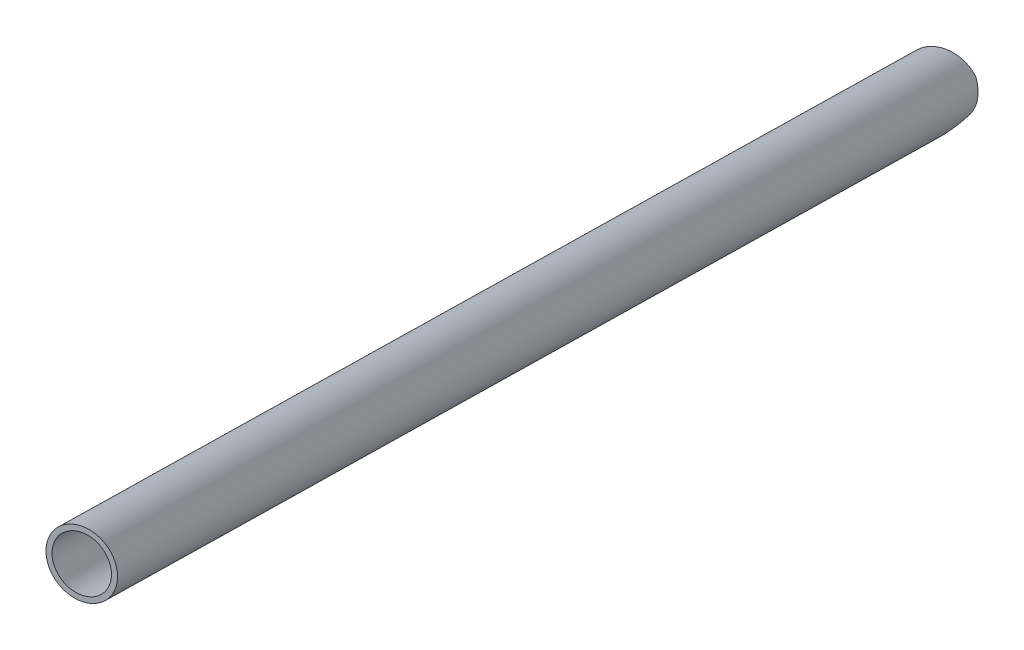
ISO-10303-21;
HEADER;
FILE_DESCRIPTION(('STEP AP214'),'2;1');
FILE_NAME('part.step','',(''),(''),'','','');
FILE_SCHEMA(('AUTOMOTIVE_DESIGN { 1 0 10303 214 1 1 1 1 }'));
ENDSEC;
DATA;
#1=APPLICATION_CONTEXT('core data for automotive mechanical design processes');
#2=APPLICATION_PROTOCOL_DEFINITION('international standard','automotive_design',2000,#1);
#3=PRODUCT_CONTEXT('',#1,'mechanical');
#4=PRODUCT('Part','Part','',(#3));
#5=PRODUCT_RELATED_PRODUCT_CATEGORY('part','',(#4));
#6=PRODUCT_DEFINITION_FORMATION('','',#4);
#7=PRODUCT_DEFINITION_CONTEXT('part definition',#1,'design');
#8=PRODUCT_DEFINITION('design','',#6,#7);
#9=PRODUCT_DEFINITION_SHAPE('','',#8);
#10=(LENGTH_UNIT() NAMED_UNIT(*) SI_UNIT(.MILLI.,.METRE.));
#11=(NAMED_UNIT(*) PLANE_ANGLE_UNIT() SI_UNIT($,.RADIAN.));
#12=(NAMED_UNIT(*) SI_UNIT($,.STERADIAN.) SOLID_ANGLE_UNIT());
#13=UNCERTAINTY_MEASURE_WITH_UNIT(LENGTH_MEASURE(1.E-05),#10,'distance_accuracy_value','');
#14=(GEOMETRIC_REPRESENTATION_CONTEXT(3) GLOBAL_UNCERTAINTY_ASSIGNED_CONTEXT((#13)) GLOBAL_UNIT_ASSIGNED_CONTEXT((#10,
#11,#12)) REPRESENTATION_CONTEXT('',''));
#15=CARTESIAN_POINT('',(0.,0.,0.));
#16=DIRECTION('',(0.,0.,1.));
#17=DIRECTION('',(1.,0.,0.));
#18=AXIS2_PLACEMENT_3D('',#15,#16,#17);
#19=CARTESIAN_POINT('',(-325.,320.,-1580.));
#20=DIRECTION('',(0.345452680982297,0.355322757581791,0.86856674075549));
#21=DIRECTION('',(0.,-0.925546956205677,0.378632845720504));
#22=AXIS2_PLACEMENT_3D('',#19,#20,#21);
#23=CYLINDRICAL_SURFACE('',#22,7.90000000000002);
#24=CARTESIAN_POINT('',(-150.,500.,-1140.));
#25=DIRECTION('',(0.136924020573454,-0.0230393226257373,0.990313587810925));
#26=DIRECTION('',(0.508281006832033,0.859722512143853,-0.0502754433782236));
#27=AXIS2_PLACEMENT_3D('',#24,#25,#26);
#28=ELLIPSE('',#27,8.78492461028727,7.90000000000002);
#29=CARTESIAN_POINT('',(-145.53478967414,507.552597454951,-1140.44166597983));
#30=VERTEX_POINT('',#29);
#31=EDGE_CURVE('E181',#30,#30,#28,.T.);
#32=ORIENTED_EDGE('',*,*,#31,.T.);
#33=EDGE_LOOP('',(#32));
#34=FACE_BOUND('',#33,.T.);
#35=CARTESIAN_POINT('',(-315.062751652289,322.90934877505,-1552.02371895885));
#36=CARTESIAN_POINT('',(-315.134473250997,323.001612742388,-1551.79817735233));
#37=CARTESIAN_POINT('',(-315.213075692378,323.097133272639,-1551.57611262653));
#38=CARTESIAN_POINT('',(-315.387846788828,323.29611463575,-1551.14179447439));
#39=CARTESIAN_POINT('',(-315.48405100144,323.399591291015,-1550.92956201805));
#40=CARTESIAN_POINT('',(-315.645886613939,323.562281394676,-1550.62239005972));
#41=CARTESIAN_POINT('',(-315.70315373489,323.618117867376,-1550.52128580889));
#42=CARTESIAN_POINT('',(-315.824263866916,323.732270928052,-1550.3245889776));
#43=CARTESIAN_POINT('',(-315.888108792042,323.790588235003,-1550.22899801413));
#44=CARTESIAN_POINT('',(-316.090461696434,323.96909405262,-1549.95344332738));
#45=CARTESIAN_POINT('',(-316.240328218652,324.093395383728,-1549.78360576437));
#46=CARTESIAN_POINT('',(-316.502023728975,324.294439176186,-1549.55576883543));
#47=CARTESIAN_POINT('',(-316.601812811816,324.36819926225,-1549.48134662495));
#48=CARTESIAN_POINT('',(-316.812483688144,324.517334800208,-1549.35238127968));
#49=CARTESIAN_POINT('',(-316.923351551352,324.592708132164,-1549.29781357127));
#50=CARTESIAN_POINT('',(-317.155289147075,324.743633066527,-1549.21247733196));
#51=CARTESIAN_POINT('',(-317.276431336805,324.819181517379,-1549.18189667246));
#52=CARTESIAN_POINT('',(-317.524303599189,324.967167525065,-1549.14743062955));
#53=CARTESIAN_POINT('',(-317.651034283709,325.039604739536,-1549.14354817658));
#54=CARTESIAN_POINT('',(-317.894538992831,325.17308951503,-1549.16039969517));
#55=CARTESIAN_POINT('',(-318.011232166373,325.234580856524,-1549.17904572553));
#56=CARTESIAN_POINT('',(-318.242825205686,325.352267883888,-1549.2346652635));
#57=CARTESIAN_POINT('',(-318.357724091305,325.408460754403,-1549.27164845002));
#58=CARTESIAN_POINT('',(-318.661370692479,325.551948639908,-1549.39093757088));
#59=CARTESIAN_POINT('',(-318.847019071835,325.634306569688,-1549.48695048911));
#60=CARTESIAN_POINT('',(-319.206380488894,325.785728158238,-1549.70756514293));
#61=CARTESIAN_POINT('',(-319.380050966344,325.854745838707,-1549.83226261912));
#62=CARTESIAN_POINT('',(-319.713400301447,325.981021474725,-1550.09895135722));
#63=CARTESIAN_POINT('',(-319.873245019865,326.03843488704,-1550.24066681557));
#64=CARTESIAN_POINT('',(-320.183209999078,326.144887056453,-1550.53739282665));
#65=CARTESIAN_POINT('',(-320.333319937005,326.193917010946,-1550.69241710022));
#66=CARTESIAN_POINT('',(-320.625391475377,326.28529293688,-1551.0124974855));
#67=CARTESIAN_POINT('',(-320.767331294544,326.327621524399,-1551.17757819826));
#68=CARTESIAN_POINT('',(-321.043735164567,326.406658859822,-1551.51498120156));
#69=CARTESIAN_POINT('',(-321.178202670158,326.443370218783,-1551.68730007982));
#70=CARTESIAN_POINT('',(-321.529032422825,326.535308199381,-1552.15547944689));
#71=CARTESIAN_POINT('',(-321.739634190833,326.58637686915,-1552.45646649666));
#72=CARTESIAN_POINT('',(-322.146308821395,326.678756946001,-1553.06962687287));
#73=CARTESIAN_POINT('',(-322.3423734399,326.720062845204,-1553.38180639995));
#74=CARTESIAN_POINT('',(-322.722593284639,326.795102213547,-1554.01505231504));
#75=CARTESIAN_POINT('',(-322.90672354202,326.82882014968,-1554.33613544781));
#76=CARTESIAN_POINT('',(-323.264288799425,326.890139438696,-1554.98464931666));
#77=CARTESIAN_POINT('',(-323.437726039135,326.917742075611,-1555.31207870447));
#78=CARTESIAN_POINT('',(-323.775633577969,326.968099613666,-1555.97301265909));
#79=CARTESIAN_POINT('',(-323.940078132898,326.990841088967,-1556.30653135865));
#80=CARTESIAN_POINT('',(-324.260392848003,327.032341725529,-1556.97791233439));
#81=CARTESIAN_POINT('',(-324.416262587859,327.051100691703,-1557.31577482249));
#82=CARTESIAN_POINT('',(-324.719892381055,327.085420560105,-1557.99482511167));
#83=CARTESIAN_POINT('',(-324.867661277613,327.100985002698,-1558.33600878777));
#84=CARTESIAN_POINT('',(-325.1557007127,327.129649335968,-1559.02160984813));
#85=CARTESIAN_POINT('',(-325.295971446685,327.142749290909,-1559.36602714783));
#86=CARTESIAN_POINT('',(-325.644676874812,327.173869853174,-1560.24856667928));
#87=CARTESIAN_POINT('',(-325.848033633516,327.19061908193,-1560.78874747158));
#88=CARTESIAN_POINT('',(-326.237593481705,327.222186546649,-1561.87545308429));
#89=CARTESIAN_POINT('',(-326.42379216756,327.237004287297,-1562.42197949302));
#90=CARTESIAN_POINT('',(-326.778032220008,327.267328313365,-1563.52061697192));
#91=CARTESIAN_POINT('',(-326.946082223163,327.282834266279,-1564.07272524779));
#92=CARTESIAN_POINT('',(-327.182830831613,327.30905742343,-1564.90507736246));
#93=CARTESIAN_POINT('',(-327.259186028803,327.31829148328,-1565.18319940305));
#94=CARTESIAN_POINT('',(-327.406285196693,327.338262830295,-1565.74086261521));
#95=CARTESIAN_POINT('',(-327.477029286697,327.349000085484,-1566.02040375649));
#96=CARTESIAN_POINT('',(-327.647181946017,327.378624772397,-1566.72551769372));
#97=CARTESIAN_POINT('',(-327.742551553386,327.398859246578,-1567.15203325064));
#98=CARTESIAN_POINT('',(-327.872339195339,327.434716828824,-1567.79429990684));
#99=CARTESIAN_POINT('',(-327.913401191853,327.44759180489,-1568.00887066674));
#100=CARTESIAN_POINT('',(-327.990467673213,327.475582105221,-1568.43876813966));
#101=CARTESIAN_POINT('',(-328.026472486376,327.490697283918,-1568.65409480268));
#102=CARTESIAN_POINT('',(-328.092599164349,327.523579690399,-1569.08494526001));
#103=CARTESIAN_POINT('',(-328.122734402132,327.541340722964,-1569.30046745504));
#104=CARTESIAN_POINT('',(-328.17626897708,327.580048498769,-1569.73204884213));
#105=CARTESIAN_POINT('',(-328.199669134683,327.600994853512,-1569.94810796554));
#106=CARTESIAN_POINT('',(-328.238521349509,327.646620011967,-1570.38036997568));
#107=CARTESIAN_POINT('',(-328.253980425301,327.671295494708,-1570.59657256577));
#108=CARTESIAN_POINT('',(-328.275480687108,327.724988256206,-1571.02888168633));
#109=CARTESIAN_POINT('',(-328.281524322493,327.754004403612,-1571.24498822715));
#110=CARTESIAN_POINT('',(-328.282311821199,327.813811671524,-1571.65487674946));
#111=CARTESIAN_POINT('',(-328.278128737796,327.844132491409,-1571.84872282016));
#112=CARTESIAN_POINT('',(-328.259058460194,327.909127398989,-1572.23518798285));
#113=CARTESIAN_POINT('',(-328.244171446623,327.943801413216,-1572.42780709548));
#114=CARTESIAN_POINT('',(-328.201946667763,328.017643385487,-1572.8105460658));
#115=CARTESIAN_POINT('',(-328.17462772075,328.056804484615,-1573.00066925567));
#116=CARTESIAN_POINT('',(-328.105708350145,328.139560010679,-1573.37737571437));
#117=CARTESIAN_POINT('',(-328.064108265339,328.183154332431,-1573.56395906707));
#118=CARTESIAN_POINT('',(-327.964165771501,328.27494455084,-1573.93482729551));
#119=CARTESIAN_POINT('',(-327.905569410897,328.323202229346,-1574.11902937865));
#120=CARTESIAN_POINT('',(-327.770662092226,328.422530565605,-1574.48007188139));
#121=CARTESIAN_POINT('',(-327.694352471511,328.473601010773,-1574.65691285557));
#122=CARTESIAN_POINT('',(-327.523648486949,328.576716044246,-1575.00123855902));
#123=CARTESIAN_POINT('',(-327.429263630416,328.628760107513,-1575.16872814744));
#124=CARTESIAN_POINT('',(-327.222948657387,328.731580802285,-1575.49293707344));
#125=CARTESIAN_POINT('',(-327.111019657599,328.782357514219,-1575.6496570956));
#126=CARTESIAN_POINT('',(-326.889260131161,328.872801598574,-1575.92857864103));
#127=CARTESIAN_POINT('',(-326.781679768766,328.912986722373,-1576.05241302255));
#128=CARTESIAN_POINT('',(-326.556140998548,328.989293163665,-1576.29155411128));
#129=CARTESIAN_POINT('',(-326.438183761886,329.025414938712,-1576.40686177814));
#130=CARTESIAN_POINT('',(-326.193114324733,329.092375287829,-1576.62917332161));
#131=CARTESIAN_POINT('',(-326.065994208984,329.123209214445,-1576.73616984888));
#132=CARTESIAN_POINT('',(-325.804047188891,329.178500067238,-1576.94206526338));
#133=CARTESIAN_POINT('',(-325.669219716932,329.202956523001,-1577.04096355289));
#134=CARTESIAN_POINT('',(-325.385154294276,329.245841250686,-1577.23658910132));
#135=CARTESIAN_POINT('',(-325.235534258519,329.263836456699,-1577.33285596077));
#136=CARTESIAN_POINT('',(-324.930611782362,329.290923108954,-1577.51728001731));
#137=CARTESIAN_POINT('',(-324.775309267141,329.300014437916,-1577.60543710757));
#138=CARTESIAN_POINT('',(-324.460358283769,329.308694736826,-1577.77413395971));
#139=CARTESIAN_POINT('',(-324.300709587436,329.308283206893,-1577.85467332065));
#140=CARTESIAN_POINT('',(-323.97830395136,329.297524070552,-1578.00856159572));
#141=CARTESIAN_POINT('',(-323.815546703933,329.287175475522,-1578.08190979361));
#142=CARTESIAN_POINT('',(-323.46188631531,329.253769400512,-1578.23295205986));
#143=CARTESIAN_POINT('',(-323.270643222757,329.228944678204,-1578.30946630659));
#144=CARTESIAN_POINT('',(-322.887179158994,329.165264307871,-1578.45372186309));
#145=CARTESIAN_POINT('',(-322.69495810132,329.126407397209,-1578.52146238263));
#146=CARTESIAN_POINT('',(-322.311004737556,329.034575470254,-1578.64848897496));
#147=CARTESIAN_POINT('',(-322.119272659723,328.981594769119,-1578.70777162866));
#148=CARTESIAN_POINT('',(-321.737816639892,328.861622251745,-1578.81803017465));
#149=CARTESIAN_POINT('',(-321.548092721317,328.794630272274,-1578.86900597016));
#150=CARTESIAN_POINT('',(-321.160633636333,328.642420526771,-1578.96556245809));
#151=CARTESIAN_POINT('',(-320.963106613906,328.556346402177,-1579.01063141133));
#152=CARTESIAN_POINT('',(-320.573323490459,328.369200084173,-1579.09150107925));
#153=CARTESIAN_POINT('',(-320.381067632062,328.268127201763,-1579.12730136794));
#154=CARTESIAN_POINT('',(-320.003222414726,328.051635993711,-1579.18951056107));
#155=CARTESIAN_POINT('',(-319.817633200204,327.936217357546,-1579.21591926218));
#156=CARTESIAN_POINT('',(-319.454410133791,327.691858850717,-1579.25912330664));
#157=CARTESIAN_POINT('',(-319.276776231222,327.562919066205,-1579.27591871125));
#158=CARTESIAN_POINT('',(-318.929141104477,327.291344151521,-1579.29967872581));
#159=CARTESIAN_POINT('',(-318.759218178317,327.148601294755,-1579.3065580043));
#160=CARTESIAN_POINT('',(-318.429699345596,326.851540015881,-1579.30977831932));
#161=CARTESIAN_POINT('',(-318.27010359801,326.697221415658,-1579.30611919366));
#162=CARTESIAN_POINT('',(-317.962095480456,326.378305748071,-1579.28770237598));
#163=CARTESIAN_POINT('',(-317.813687306873,326.21370486581,-1579.27294054196));
#164=CARTESIAN_POINT('',(-317.528875963735,325.875825582994,-1579.2316175292));
#165=CARTESIAN_POINT('',(-317.392472597366,325.702547324775,-1579.20505654394));
#166=CARTESIAN_POINT('',(-317.132765768942,325.349780363354,-1579.1394115678));
#167=CARTESIAN_POINT('',(-317.009412245917,325.170319175619,-1579.10037792829));
#168=CARTESIAN_POINT('',(-316.775555381649,324.806521069631,-1579.0087350014));
#169=CARTESIAN_POINT('',(-316.665052924449,324.622183817016,-1578.95612478086));
#170=CARTESIAN_POINT('',(-316.457143866293,324.251104154342,-1578.83618652381));
#171=CARTESIAN_POINT('',(-316.359727784822,324.064363594029,-1578.76886923581));
#172=CARTESIAN_POINT('',(-316.177815007134,323.691078403504,-1578.61818263235));
#173=CARTESIAN_POINT('',(-316.093314917161,323.504533734658,-1578.53481754661));
#174=CARTESIAN_POINT('',(-315.953624406063,323.174537717612,-1578.37050559913));
#175=CARTESIAN_POINT('',(-315.896037001182,323.030436810528,-1578.29288559277));
#176=CARTESIAN_POINT('',(-315.788203214879,322.746050158138,-1578.1263949592));
#177=CARTESIAN_POINT('',(-315.737955272766,322.605763606911,-1578.03752673138));
#178=CARTESIAN_POINT('',(-315.64435481722,322.331052867997,-1577.84831147566));
#179=CARTESIAN_POINT('',(-315.600992174019,322.196620283366,-1577.74798169124));
#180=CARTESIAN_POINT('',(-315.520410909517,321.935286122479,-1577.5356946956));
#181=CARTESIAN_POINT('',(-315.483192274949,321.808384529961,-1577.42373750947));
#182=CARTESIAN_POINT('',(-315.413983544143,321.563453222816,-1577.1881757229));
#183=CARTESIAN_POINT('',(-315.382011844821,321.445455476406,-1577.06453243908));
#184=CARTESIAN_POINT('',(-315.322556411224,321.220257758669,-1576.8067922186));
#185=CARTESIAN_POINT('',(-315.295072514544,321.113057396662,-1576.67269566048));
#186=CARTESIAN_POINT('',(-315.243667632452,320.910342145585,-1576.39528542463));
#187=CARTESIAN_POINT('',(-315.219747248778,320.814829230557,-1576.25197019606));
#188=CARTESIAN_POINT('',(-315.174611006077,320.635784007447,-1575.95761960739));
#189=CARTESIAN_POINT('',(-315.153395957047,320.552255286592,-1575.80658195401));
#190=CARTESIAN_POINT('',(-315.10590726777,320.370016818226,-1575.44490124368));
#191=CARTESIAN_POINT('',(-315.080429428612,320.276082029009,-1575.23174573541));
#192=CARTESIAN_POINT('',(-315.031638422401,320.107714601253,-1574.79764751774));
#193=CARTESIAN_POINT('',(-315.008326293903,320.033291288489,-1574.57670114161));
#194=CARTESIAN_POINT('',(-314.962903767615,319.901263406701,-1574.12894656505));
#195=CARTESIAN_POINT('',(-314.940797839137,319.843718331379,-1573.90212062546));
#196=CARTESIAN_POINT('',(-314.897361373613,319.743248018162,-1573.44529266768));
#197=CARTESIAN_POINT('',(-314.876030695554,319.700320109504,-1573.21529123771));
#198=CARTESIAN_POINT('',(-314.824044330951,319.609560295052,-1572.64568561207));
#199=CARTESIAN_POINT('',(-314.793674541773,319.568762740206,-1572.30494543927));
#200=CARTESIAN_POINT('',(-314.733767514241,319.507488823733,-1571.62150232634));
#201=CARTESIAN_POINT('',(-314.704230794737,319.487024866034,-1571.27879831625));
#202=CARTESIAN_POINT('',(-314.646092253586,319.462024137762,-1570.59202840306));
#203=CARTESIAN_POINT('',(-314.617492597903,319.457521997677,-1570.24796115818));
#204=CARTESIAN_POINT('',(-314.561593805092,319.461319680913,-1569.55990387682));
#205=CARTESIAN_POINT('',(-314.534294384078,319.469616696411,-1569.21591383996));
#206=CARTESIAN_POINT('',(-314.481162315284,319.496768894256,-1568.52594608454));
#207=CARTESIAN_POINT('',(-314.455340654451,319.515694067962,-1568.17997039635));
#208=CARTESIAN_POINT('',(-314.405736731456,319.562427529641,-1567.48847039269));
#209=CARTESIAN_POINT('',(-314.38195455591,319.590236194654,-1567.142946097));
#210=CARTESIAN_POINT('',(-314.336843165949,319.653435740117,-1566.45290803349));
#211=CARTESIAN_POINT('',(-314.31551069727,319.68881637842,-1566.10839353164));
#212=CARTESIAN_POINT('',(-314.275649365077,319.766269877681,-1565.41995318487));
#213=CARTESIAN_POINT('',(-314.257120559204,319.808342876193,-1565.0760273522));
#214=CARTESIAN_POINT('',(-314.218713248521,319.910642167128,-1564.29636742617));
#215=CARTESIAN_POINT('',(-314.199812603609,319.972707165037,-1563.8608255233));
#216=CARTESIAN_POINT('',(-314.168046512931,320.105621558556,-1562.99085276412));
#217=CARTESIAN_POINT('',(-314.15518125218,320.176471223373,-1562.55642194226));
#218=CARTESIAN_POINT('',(-314.136460511769,320.326505421008,-1561.68839268697));
#219=CARTESIAN_POINT('',(-314.130612147163,320.40569832544,-1561.25479554277));
#220=CARTESIAN_POINT('',(-314.127103084642,320.572142322438,-1560.38912567151));
#221=CARTESIAN_POINT('',(-314.129442090346,320.659393123197,-1559.95705288985));
#222=CARTESIAN_POINT('',(-314.143669988183,320.841448162128,-1559.0975264601));
#223=CARTESIAN_POINT('',(-314.155497883899,320.936200682364,-1558.67006092668));
#224=CARTESIAN_POINT('',(-314.190380704967,321.134116362551,-1557.81745837149));
#225=CARTESIAN_POINT('',(-314.213437074569,321.23728060303,-1557.39232165637));
#226=CARTESIAN_POINT('',(-314.273057300455,321.452568161879,-1556.54586640127));
#227=CARTESIAN_POINT('',(-314.30960280675,321.564679147875,-1556.12454346723));
#228=CARTESIAN_POINT('',(-314.399356479976,321.799089982005,-1555.28658527251));
#229=CARTESIAN_POINT('',(-314.45255871084,321.921386188986,-1554.86994839652));
#230=CARTESIAN_POINT('',(-314.54859572444,322.114279137691,-1554.24882622035));
#231=CARTESIAN_POINT('',(-314.583463706925,322.180398404553,-1554.04171013276));
#232=CARTESIAN_POINT('',(-314.65946223693,322.316023024786,-1553.62970484601));
#233=CARTESIAN_POINT('',(-314.700593470795,322.385528748686,-1553.42481589354));
#234=CARTESIAN_POINT('',(-314.79008615696,322.528227869215,-1553.0181853567));
#235=CARTESIAN_POINT('',(-314.838439005685,322.601416809912,-1552.81644033839));
#236=CARTESIAN_POINT('',(-314.943727396589,322.752040490303,-1552.41683516243));
#237=CARTESIAN_POINT('',(-315.000661045961,322.829474291247,-1552.21897415886));
#238=CARTESIAN_POINT('',(-315.062751652289,322.90934877505,-1552.02371895885));
#239=B_SPLINE_CURVE_WITH_KNOTS('',3,(#35,#36,#37,#38,#39,#40,#41,#42,#43,#44,#45,#46,#47,#48,
#49,#50,#51,#52,#53,#54,#55,#56,#57,#58,#59,#60,#61,#62,#63,#64,#65,#66,#67,#68,#69,#70,#71,#72,
#73,#74,#75,#76,#77,#78,#79,#80,#81,#82,#83,#84,#85,#86,#87,#88,#89,#90,#91,#92,#93,#94,#95,#96,
#97,#98,#99,#100,#101,#102,#103,#104,#105,#106,#107,#108,#109,#110,#111,#112,#113,#114,#115,
#116,#117,#118,#119,#120,#121,#122,#123,#124,#125,#126,#127,#128,#129,#130,#131,#132,#133,#134,
#135,#136,#137,#138,#139,#140,#141,#142,#143,#144,#145,#146,#147,#148,#149,#150,#151,#152,#153,
#154,#155,#156,#157,#158,#159,#160,#161,#162,#163,#164,#165,#166,#167,#168,#169,#170,#171,#172,
#173,#174,#175,#176,#177,#178,#179,#180,#181,#182,#183,#184,#185,#186,#187,#188,#189,#190,#191,
#192,#193,#194,#195,#196,#197,#198,#199,#200,#201,#202,#203,#204,#205,#206,#207,#208,#209,#210,
#211,#212,#213,#214,#215,#216,#217,#218,#219,#220,#221,#222,#223,#224,#225,#226,#227,#228,#229,
#230,#231,#232,#233,#234,#235,#236,#237,#238),.UNSPECIFIED.,.T.,.F.,(4,2,2,2,2,2,2,2,2,2,2,2,2,
2,2,2,2,2,2,2,2,2,2,2,2,2,2,2,2,2,2,2,2,2,2,2,2,2,2,2,2,2,2,2,2,2,2,2,2,2,2,2,2,2,2,2,2,2,2,2,2,
2,2,2,2,2,2,2,2,2,2,2,2,2,2,2,2,2,2,2,2,2,2,2,2,2,2,2,2,2,2,2,2,2,2,2,2,2,2,2,2,4),(0.,
0.761938753431059,1.52543405243347,1.91188162196488,2.29844196176946,3.06757351031861,
3.50024357268385,3.93237628925763,4.36786066960813,4.8033928486521,5.20147574702147,
5.59976898960258,6.26980396084841,6.94210862172127,7.60470262427211,8.2679881321772,
8.93296702179642,9.59763586388088,10.7094349856174,11.8218598635848,12.9365416354506,
14.0509891350211,15.1684759102346,16.2860174139014,17.4023136219887,18.5185807170563,
20.2505555133723,21.9829735912936,23.7145635822883,24.5801921024936,25.4458022127219,
26.7579459844109,27.4144214634161,28.0708543037152,28.7257735987529,29.3806130805685,
30.0348727952908,30.6889622798605,31.2774150974327,31.8658579851956,32.4534130918945,
33.0409542611618,33.6377712650992,34.2345432239665,34.8310021472479,35.427423120527,
35.9335039290597,36.4395276930506,36.9459939436051,37.4524975414583,37.9884445844088,
38.5243986866208,39.0603809818302,39.5964166065085,40.2181463417642,40.8399320352162,
41.4619683770559,42.0840119660201,42.7436219858231,43.4032623156579,44.0629169263007,
44.7225673340743,45.3878610372984,46.0531649794062,46.7187172435034,47.3842585940431,
48.0471464344518,48.7100798489511,49.3725303765248,50.034806540876,50.5548276719838,
51.0747380624082,51.5938763193258,52.1130134551974,52.6339336127314,53.1548349151835,
53.6758240782231,54.1969688649217,54.8987700814342,55.6009061243281,56.3054881593452,
57.0099413880551,58.0426208669765,59.075929916374,60.1114794482396,61.1468018378827,
62.1890236351734,63.2312896729394,64.2721547120528,65.3130411476432,66.6339460800074,
67.9548915016306,69.2771752178874,70.5994110681139,71.9132147895018,73.2271875421352,
74.5393793763065,75.8511041072377,76.5115810919957,77.1721305059272,77.8318991512641,
78.4915224730745),.UNSPECIFIED.);
#240=CARTESIAN_POINT('',(-314.254237401406,319.817607713583,-1565.01054982519));
#241=VERTEX_POINT('',#240);
#242=CARTESIAN_POINT('',(-324.682386689549,329.302305976699,-1577.65492780784));
#243=VERTEX_POINT('',#242);
#244=EDGE_CURVE('E133',#241,#243,#239,.T.);
#245=ORIENTED_EDGE('',*,*,#244,.T.);
#246=CARTESIAN_POINT('',(-317.472241548848,320.431016310017,-1558.08186498448));
#247=CARTESIAN_POINT('',(-317.63813074169,320.464266602746,-1558.00060624777));
#248=CARTESIAN_POINT('',(-317.810937112455,320.498781745218,-1557.93373181016));
#249=CARTESIAN_POINT('',(-318.165397213559,320.569326791691,-1557.83172279909));
#250=CARTESIAN_POINT('',(-318.347053919309,320.605357204549,-1557.79659897863));
#251=CARTESIAN_POINT('',(-318.712614336579,320.677656094674,-1557.75763482161));
#252=CARTESIAN_POINT('',(-318.896503563385,320.713922670102,-1557.75364892601));
#253=CARTESIAN_POINT('',(-319.262780506473,320.786023608516,-1557.77327457647));
#254=CARTESIAN_POINT('',(-319.44516706243,320.821857645921,-1557.79690574307));
#255=CARTESIAN_POINT('',(-319.915316281558,320.914157695831,-1557.88886912182));
#256=CARTESIAN_POINT('',(-320.199615927935,320.969899726623,-1557.97565901436));
#257=CARTESIAN_POINT('',(-320.613383873994,321.051165638443,-1558.13796858501));
#258=CARTESIAN_POINT('',(-320.749435010719,321.077910811392,-1558.19756737989));
#259=CARTESIAN_POINT('',(-321.017329088519,321.130659372517,-1558.3258895191));
#260=CARTESIAN_POINT('',(-321.149172800415,321.156662896474,-1558.39461118004));
#261=CARTESIAN_POINT('',(-321.518956778656,321.229770567945,-1558.60140076128));
#262=CARTESIAN_POINT('',(-321.751852118166,321.276028588166,-1558.74877370215));
#263=CARTESIAN_POINT('',(-322.204485196678,321.366564711261,-1559.06310860946));
#264=CARTESIAN_POINT('',(-322.424210765859,321.410840973566,-1559.23008828493));
#265=CARTESIAN_POINT('',(-322.852198047963,321.497930369903,-1559.579477102));
#266=CARTESIAN_POINT('',(-323.060429388053,321.540739523799,-1559.76192416824));
#267=CARTESIAN_POINT('',(-323.465972935673,321.625181976612,-1560.13861665749));
#268=CARTESIAN_POINT('',(-323.663288578262,321.6668156434,-1560.33285832803));
#269=CARTESIAN_POINT('',(-324.069788840155,321.753963165687,-1560.7533218496));
#270=CARTESIAN_POINT('',(-324.277810455529,321.799386449685,-1560.98068274367));
#271=CARTESIAN_POINT('',(-324.682953539391,321.889821180637,-1561.4450440874));
#272=CARTESIAN_POINT('',(-324.880072401126,321.934832526973,-1561.68204681904));
#273=CARTESIAN_POINT('',(-325.264487968673,322.025003596949,-1562.1642719543));
#274=CARTESIAN_POINT('',(-325.451773655136,322.070163429228,-1562.40950309511));
#275=CARTESIAN_POINT('',(-325.816968311288,322.161124103961,-1562.9066857261));
#276=CARTESIAN_POINT('',(-325.99487806512,322.206924892403,-1563.1586366516));
#277=CARTESIAN_POINT('',(-326.341870747347,322.299780111547,-1563.66839839841));
#278=CARTESIAN_POINT('',(-326.510951593767,322.346834834026,-1563.92621058149));
#279=CARTESIAN_POINT('',(-326.840548998569,322.442874511213,-1564.44691137729));
#280=CARTESIAN_POINT('',(-327.001065189705,322.491859548534,-1564.70980020705));
#281=CARTESIAN_POINT('',(-327.31350801084,322.592533643663,-1565.23984561705));
#282=CARTESIAN_POINT('',(-327.465441144419,322.644220595399,-1565.50699876377));
#283=CARTESIAN_POINT('',(-327.76071796201,322.751325524282,-1566.04524929581));
#284=CARTESIAN_POINT('',(-327.904062394054,322.806743175608,-1566.31634633507));
#285=CARTESIAN_POINT('',(-328.178809685239,322.921333616941,-1566.85622878493));
#286=CARTESIAN_POINT('',(-328.310402250561,322.98040087604,-1567.12493982817));
#287=CARTESIAN_POINT('',(-328.564285787081,323.104836572062,-1567.66533727979));
#288=CARTESIAN_POINT('',(-328.686575900395,323.170205588886,-1567.93702395995));
#289=CARTESIAN_POINT('',(-328.92057656324,323.309173666333,-1568.48272175015));
#290=CARTESIAN_POINT('',(-329.032291711297,323.382769119043,-1568.75673179288));
#291=CARTESIAN_POINT('',(-329.243259783625,323.54075411108,-1569.30644528916));
#292=CARTESIAN_POINT('',(-329.342515887506,323.625140885265,-1569.58214829175));
#293=CARTESIAN_POINT('',(-329.499219077553,323.78172110466,-1570.0547796893));
#294=CARTESIAN_POINT('',(-329.560484891379,323.850451641454,-1570.25158170226));
#295=CARTESIAN_POINT('',(-329.673543176923,323.996493910318,-1570.64480876506));
#296=CARTESIAN_POINT('',(-329.72533455238,324.073806633748,-1570.84123376868));
#297=CARTESIAN_POINT('',(-329.817236022837,324.238311280946,-1571.23221131788));
#298=CARTESIAN_POINT('',(-329.857371360149,324.325481279899,-1571.42676701398));
#299=CARTESIAN_POINT('',(-329.923448651745,324.511180331269,-1571.8128598716));
#300=CARTESIAN_POINT('',(-329.949397676572,324.6097036954,-1572.00439849053));
#301=CARTESIAN_POINT('',(-329.979081095655,324.788886027559,-1572.32816013689));
#302=CARTESIAN_POINT('',(-329.987051691912,324.866567368588,-1572.46164371185));
#303=CARTESIAN_POINT('',(-329.993087127691,325.028035431531,-1572.72507803195));
#304=CARTESIAN_POINT('',(-329.991155202541,325.111820150546,-1572.85502991701));
#305=CARTESIAN_POINT('',(-329.976395608444,325.284962911836,-1573.11030630013));
#306=CARTESIAN_POINT('',(-329.963582004482,325.374313621772,-1573.23563655373));
#307=CARTESIAN_POINT('',(-329.926349138807,325.557811197983,-1573.48096381055));
#308=CARTESIAN_POINT('',(-329.90192986393,325.651958069699,-1573.60096080772));
#309=CARTESIAN_POINT('',(-329.841082879518,325.843979379464,-1573.83518932698));
#310=CARTESIAN_POINT('',(-329.804631048877,325.941860952841,-1573.94940873221));
#311=CARTESIAN_POINT('',(-329.719811663811,326.139653995344,-1574.1714748752));
#312=CARTESIAN_POINT('',(-329.671443899045,326.239565500275,-1574.27932150043));
#313=CARTESIAN_POINT('',(-329.563139137754,326.440005424084,-1574.48882820975));
#314=CARTESIAN_POINT('',(-329.503181612938,326.540534626529,-1574.59047688918));
#315=CARTESIAN_POINT('',(-329.372440960178,326.740531410024,-1574.78768958045));
#316=CARTESIAN_POINT('',(-329.301655250158,326.839998731793,-1574.88325213328));
#317=CARTESIAN_POINT('',(-329.131404421565,327.060721973514,-1575.0916306256));
#318=CARTESIAN_POINT('',(-329.029170141811,327.18130837242,-1575.2028967074));
#319=CARTESIAN_POINT('',(-328.810832767945,327.416523702945,-1575.41785750042));
#320=CARTESIAN_POINT('',(-328.694726238828,327.5311511489,-1575.52155032608));
#321=CARTESIAN_POINT('',(-328.450176516673,327.752775332637,-1575.72256833226));
#322=CARTESIAN_POINT('',(-328.321724535499,327.859766538712,-1575.81988889257));
#323=CARTESIAN_POINT('',(-328.054047543223,328.064636986486,-1576.00909731773));
#324=CARTESIAN_POINT('',(-327.91482314431,328.162516745286,-1576.10098549079));
#325=CARTESIAN_POINT('',(-327.624569576713,328.349595053118,-1576.28166655888));
#326=CARTESIAN_POINT('',(-327.473383269321,328.438623278116,-1576.37038314076));
#327=CARTESIAN_POINT('',(-327.162594925325,328.605165232088,-1576.54377698687));
#328=CARTESIAN_POINT('',(-327.002992884209,328.682678954887,-1576.62845424894));
#329=CARTESIAN_POINT('',(-326.67665070048,328.825386447195,-1576.79425805455));
#330=CARTESIAN_POINT('',(-326.509912151228,328.890582949337,-1576.87538538259));
#331=CARTESIAN_POINT('',(-326.170457172258,329.008025305627,-1577.03445029272));
#332=CARTESIAN_POINT('',(-325.997740499435,329.060270632396,-1577.11238774482));
#333=CARTESIAN_POINT('',(-325.625314268833,329.157036863067,-1577.27495416176));
#334=CARTESIAN_POINT('',(-325.42495491816,329.199743392108,-1577.35918168641));
#335=CARTESIAN_POINT('',(-325.019762862745,329.267450647854,-1577.5239466623));
#336=CARTESIAN_POINT('',(-324.814929803952,329.292449967934,-1577.60448381991));
#337=CARTESIAN_POINT('',(-324.402370946446,329.324343269387,-1577.76182116544));
#338=CARTESIAN_POINT('',(-324.194644388006,329.331232402046,-1577.83862034717));
#339=CARTESIAN_POINT('',(-323.777972250412,329.326678097396,-1577.98825509375));
#340=CARTESIAN_POINT('',(-323.569026699953,329.315235089912,-1578.06109075148));
#341=CARTESIAN_POINT('',(-323.151725058578,329.274020938562,-1578.20240613934));
#342=CARTESIAN_POINT('',(-322.943368573671,329.244269748656,-1578.27089052237));
#343=CARTESIAN_POINT('',(-322.528554012303,329.166632228494,-1578.40317339338));
#344=CARTESIAN_POINT('',(-322.322095946054,329.118745800742,-1578.46697185617));
#345=CARTESIAN_POINT('',(-321.912581923893,329.005214468702,-1578.58936782275));
#346=CARTESIAN_POINT('',(-321.709525512091,328.939571964627,-1578.64796602806));
#347=CARTESIAN_POINT('',(-321.308175615034,328.79108166461,-1578.75937982424));
#348=CARTESIAN_POINT('',(-321.109882104654,328.708233959445,-1578.81219544561));
#349=CARTESIAN_POINT('',(-320.720782318831,328.526740530633,-1578.91099975088));
#350=CARTESIAN_POINT('',(-320.529931587078,328.428215910309,-1578.9570359416));
#351=CARTESIAN_POINT('',(-320.155318066151,328.215819903651,-1579.0419852096));
#352=CARTESIAN_POINT('',(-319.971555279321,328.101948512244,-1579.08089828454));
#353=CARTESIAN_POINT('',(-319.612033638625,327.859841310546,-1579.15074750598));
#354=CARTESIAN_POINT('',(-319.436278440282,327.731599030453,-1579.18168003877));
#355=CARTESIAN_POINT('',(-319.093712659303,327.461984941917,-1579.23453415249));
#356=CARTESIAN_POINT('',(-318.926902056654,327.320613162854,-1579.25645575358));
#357=CARTESIAN_POINT('',(-318.600719861812,327.024093546364,-1579.29032773384));
#358=CARTESIAN_POINT('',(-318.441480031526,326.868784719988,-1579.30213868094));
#359=CARTESIAN_POINT('',(-318.133446749544,326.547665817644,-1579.31380588482));
#360=CARTESIAN_POINT('',(-317.984654401578,326.381854635657,-1579.3136608804));
#361=CARTESIAN_POINT('',(-317.697992373478,326.041713586693,-1579.29964664202));
#362=CARTESIAN_POINT('',(-317.560117588755,325.867387763186,-1579.28578386333));
#363=CARTESIAN_POINT('',(-317.295456633144,325.512426391152,-1579.24224295266));
#364=CARTESIAN_POINT('',(-317.168666994333,325.331792840889,-1579.21256978763));
#365=CARTESIAN_POINT('',(-316.957108208088,325.013513161989,-1579.14490018035));
#366=CARTESIAN_POINT('',(-316.869864023975,324.87664158604,-1579.11095120508));
#367=CARTESIAN_POINT('',(-316.701500576579,324.602370048221,-1579.03189271963));
#368=CARTESIAN_POINT('',(-316.62037974668,324.464970231016,-1578.98678607676));
#369=CARTESIAN_POINT('',(-316.464286726296,324.191511979149,-1578.88450011531));
#370=CARTESIAN_POINT('',(-316.389303690833,324.055451569358,-1578.82734275779));
#371=CARTESIAN_POINT('',(-316.245161423264,323.78629035589,-1578.70010464212));
#372=CARTESIAN_POINT('',(-316.176002142532,323.653189527508,-1578.63002399189));
#373=CARTESIAN_POINT('',(-316.042731264715,323.390873393093,-1578.47588615459));
#374=CARTESIAN_POINT('',(-315.978666176048,323.261699356978,-1578.39171810406));
#375=CARTESIAN_POINT('',(-315.855924841707,323.010413809248,-1578.20998340011));
#376=CARTESIAN_POINT('',(-315.797248194687,322.888301771887,-1578.11241774594));
#377=CARTESIAN_POINT('',(-315.684896594466,322.652802759673,-1577.90470764099));
#378=CARTESIAN_POINT('',(-315.631221481991,322.539415507001,-1577.79456359102));
#379=CARTESIAN_POINT('',(-315.528422323783,322.322441855752,-1577.56308025342));
#380=CARTESIAN_POINT('',(-315.479298902527,322.218856801963,-1577.44173943418));
#381=CARTESIAN_POINT('',(-315.377019466964,322.004954042887,-1577.16786133683));
#382=CARTESIAN_POINT('',(-315.324625320598,321.896547738375,-1577.01354982552));
#383=CARTESIAN_POINT('',(-315.224693310312,321.693409447752,-1576.69472729831));
#384=CARTESIAN_POINT('',(-315.177156878587,321.598681491033,-1576.53021329726));
#385=CARTESIAN_POINT('',(-315.086174575739,321.421540290166,-1576.19305022502));
#386=CARTESIAN_POINT('',(-315.042740391221,321.339161858102,-1576.02037989689));
#387=CARTESIAN_POINT('',(-314.959590085919,321.185575326341,-1575.66934505897));
#388=CARTESIAN_POINT('',(-314.919873723896,321.114366501681,-1575.49098091963));
#389=CARTESIAN_POINT('',(-314.833804231812,320.964246531591,-1575.08286592513));
#390=CARTESIAN_POINT('',(-314.788429046515,320.888185560631,-1574.85186717029));
#391=CARTESIAN_POINT('',(-314.702390938029,320.748663382466,-1574.38518710145));
#392=CARTESIAN_POINT('',(-314.661730202347,320.6852080146,-1574.1495036727));
#393=CARTESIAN_POINT('',(-314.584759015715,320.568576114241,-1573.67448976007));
#394=CARTESIAN_POINT('',(-314.548456276899,320.5154177047,-1573.43515363159));
#395=CARTESIAN_POINT('',(-314.480131623213,320.417719264533,-1572.95418503603));
#396=CARTESIAN_POINT('',(-314.448109050654,320.37317790934,-1572.71255292787));
#397=CARTESIAN_POINT('',(-314.388034667231,320.290927323533,-1572.22542796914));
#398=CARTESIAN_POINT('',(-314.36002033229,320.253281754575,-1571.97991986067));
#399=CARTESIAN_POINT('',(-314.308351067804,320.184179719776,-1571.48757969959));
#400=CARTESIAN_POINT('',(-314.284696251191,320.152723414266,-1571.24074761285));
#401=CARTESIAN_POINT('',(-314.241895504722,320.095155640872,-1570.7463618762));
#402=CARTESIAN_POINT('',(-314.222744483608,320.069038142216,-1570.49880936443));
#403=CARTESIAN_POINT('',(-314.189105129659,320.021424630059,-1570.00294247785));
#404=CARTESIAN_POINT('',(-314.174616918412,319.999928737078,-1569.75462808334));
#405=CARTESIAN_POINT('',(-314.146419967147,319.954353218943,-1569.17214682264));
#406=CARTESIAN_POINT('',(-314.1346839258,319.931917270472,-1568.83775293576));
#407=CARTESIAN_POINT('',(-314.120839439695,319.893476256546,-1568.16837750705));
#408=CARTESIAN_POINT('',(-314.118731573593,319.877471577663,-1567.83339593111));
#409=CARTESIAN_POINT('',(-314.125158470043,319.851234650604,-1567.16270502715));
#410=CARTESIAN_POINT('',(-314.133712071448,319.841012666922,-1566.82699546026));
#411=CARTESIAN_POINT('',(-314.162790969072,319.825982640523,-1566.15598247408));
#412=CARTESIAN_POINT('',(-314.183315372594,319.821174194182,-1565.82067902639));
#413=CARTESIAN_POINT('',(-314.237689924758,319.816801359874,-1565.15502382537));
#414=CARTESIAN_POINT('',(-314.271382266025,319.817176614218,-1564.82465984686));
#415=CARTESIAN_POINT('',(-314.354209974003,319.823027569996,-1564.16577995704));
#416=CARTESIAN_POINT('',(-314.403349633668,319.828504690117,-1563.83726458533));
#417=CARTESIAN_POINT('',(-314.519676049402,319.844737964442,-1563.184522667));
#418=CARTESIAN_POINT('',(-314.586809544067,319.855478615193,-1562.86028637935));
#419=CARTESIAN_POINT('',(-314.742836199027,319.882651317648,-1562.21742422397));
#420=CARTESIAN_POINT('',(-314.831711802573,319.899078781672,-1561.89879405072));
#421=CARTESIAN_POINT('',(-314.983384009583,319.928186504011,-1561.4330663445));
#422=CARTESIAN_POINT('',(-315.035909196382,319.938413430927,-1561.28244986995));
#423=CARTESIAN_POINT('',(-315.147963146513,319.960476670546,-1560.98392478978));
#424=CARTESIAN_POINT('',(-315.207492679888,319.972313160222,-1560.83601648394));
#425=CARTESIAN_POINT('',(-315.33443188374,319.997735595456,-1560.54355743975));
#426=CARTESIAN_POINT('',(-315.401849783047,320.011323369411,-1560.39901039951));
#427=CARTESIAN_POINT('',(-315.545428312151,320.040382734103,-1560.11455106792));
#428=CARTESIAN_POINT('',(-315.621587561231,320.055854027358,-1559.97463804911));
#429=CARTESIAN_POINT('',(-315.83953403372,320.10021383374,-1559.60635519884));
#430=CARTESIAN_POINT('',(-315.990399936853,320.131005358601,-1559.3834173939));
#431=CARTESIAN_POINT('',(-316.324729970298,320.199140590699,-1558.9647873843));
#432=CARTESIAN_POINT('',(-316.508086676679,320.236462700999,-1558.76900907368));
#433=CARTESIAN_POINT('',(-316.82487238227,320.30066099289,-1558.49269781603));
#434=CARTESIAN_POINT('',(-316.946747637975,320.325304842762,-1558.39838217409));
#435=CARTESIAN_POINT('',(-317.201574489094,320.376680870356,-1558.22669656241));
#436=CARTESIAN_POINT('',(-317.334524388768,320.403412728325,-1558.14932400493));
#437=CARTESIAN_POINT('',(-317.472241548848,320.431016310017,-1558.08186498448));
#438=B_SPLINE_CURVE_WITH_KNOTS('',3,(#246,#247,#248,#249,#250,#251,#252,#253,#254,#255,#256,
#257,#258,#259,#260,#261,#262,#263,#264,#265,#266,#267,#268,#269,#270,#271,#272,#273,#274,#275,
#276,#277,#278,#279,#280,#281,#282,#283,#284,#285,#286,#287,#288,#289,#290,#291,#292,#293,#294,
#295,#296,#297,#298,#299,#300,#301,#302,#303,#304,#305,#306,#307,#308,#309,#310,#311,#312,#313,
#314,#315,#316,#317,#318,#319,#320,#321,#322,#323,#324,#325,#326,#327,#328,#329,#330,#331,#332,
#333,#334,#335,#336,#337,#338,#339,#340,#341,#342,#343,#344,#345,#346,#347,#348,#349,#350,#351,
#352,#353,#354,#355,#356,#357,#358,#359,#360,#361,#362,#363,#364,#365,#366,#367,#368,#369,#370,
#371,#372,#373,#374,#375,#376,#377,#378,#379,#380,#381,#382,#383,#384,#385,#386,#387,#388,#389,
#390,#391,#392,#393,#394,#395,#396,#397,#398,#399,#400,#401,#402,#403,#404,#405,#406,#407,#408,
#409,#410,#411,#412,#413,#414,#415,#416,#417,#418,#419,#420,#421,#422,#423,#424,#425,#426,#427,
#428,#429,#430,#431,#432,#433,#434,#435,#436,#437),.UNSPECIFIED.,.T.,.F.,(4,2,2,2,2,2,2,2,2,2,2,
2,2,2,2,2,2,2,2,2,2,2,2,2,2,2,2,2,2,2,2,2,2,2,2,2,2,2,2,2,2,2,2,2,2,2,2,2,2,2,2,2,2,2,2,2,2,2,2,
2,2,2,2,2,2,2,2,2,2,2,2,2,2,2,2,2,2,2,2,2,2,2,2,2,2,2,2,2,2,2,2,2,2,2,2,4),(0.,
0.562508896154309,1.12520822607127,1.68527554730856,2.24574101026009,3.1474980568326,
3.60006963399414,4.05255781608384,4.88954559655839,5.7272952542821,6.56716194263078,
7.40676281210869,8.34084426980254,9.27514810129478,10.2104775228148,11.1457285949256,
12.0811992249927,13.0167099352311,13.9515020080767,14.8862125464998,15.8009520400853,
16.7157757901683,17.6301998836807,18.5443901351004,19.1959169386791,19.847519080985,
20.4976994079829,21.147555385135,21.6110802389799,22.0744536607792,22.5372290647112,
23.0000049935056,23.4637143195292,23.9274318316079,24.39197835396,24.8566358246847,
25.4357725419077,26.0150529615877,26.5947488413235,27.1744118015555,27.7636604273107,
28.3529093690839,28.9420274292763,29.5311694747582,30.1948715334675,30.8586263093784,
31.5225587769959,32.1864756779802,32.8496702590437,33.5128684055421,34.1759769476733,
34.8390819912023,35.4972932533972,36.1555047331159,36.8140137405555,37.4725212744487,
38.1399701047106,38.8074893422488,39.47469461023,40.1416903943974,40.638729283823,
41.135640575386,41.6316540106226,42.1276633039228,42.6277773232752,43.1278540625435,
43.6279148714667,44.1280441858075,44.7142814642916,45.3006910868537,45.888723853399,
46.4767184379099,47.2183722811167,47.9603688863111,48.7036597922951,49.4468363526376,
50.1965616167277,50.9463062996152,51.6951993250425,52.4441118771653,53.4499584773118,
54.4558655282038,55.4635525430464,56.4711644214188,57.4670539126417,58.4632204158436,
59.4564702401687,60.4489206476671,60.9282924625236,61.4077170278084,61.8876462450158,
62.3674997603195,63.1777842601861,63.9854380822572,64.4524906259145,64.9194717858762),.UNSPECIFIED.);
#439=CARTESIAN_POINT('',(-318.332100380655,326.754460846615,-1579.30612129413));
#440=VERTEX_POINT('',#439);
#441=EDGE_CURVE('E126',#243,#440,#438,.T.);
#442=ORIENTED_EDGE('',*,*,#441,.T.);
#443=CARTESIAN_POINT('',(-316.05960123844,323.423513088986,-1578.49348689994));
#444=VERTEX_POINT('',#443);
#445=EDGE_CURVE('E141',#440,#444,#239,.T.);
#446=ORIENTED_EDGE('',*,*,#445,.T.);
#447=EDGE_CURVE('E121',#444,#241,#438,.T.);
#448=ORIENTED_EDGE('',*,*,#447,.T.);
#449=EDGE_LOOP('',(#245,#442,#446,#448));
#450=FACE_BOUND('',#449,.T.);
#451=ADVANCED_FACE('F39',(#34,#450),#23,.F.);
#452=CARTESIAN_POINT('',(-325.,320.,-1580.));
#453=DIRECTION('',(0.345452680982297,0.355322757581791,0.86856674075549));
#454=DIRECTION('',(0.,-0.925546956205677,0.378632845720504));
#455=AXIS2_PLACEMENT_3D('',#452,#453,#454);
#456=CYLINDRICAL_SURFACE('',#455,9.49999999999999);
#457=CARTESIAN_POINT('',(-150.,500.,-1140.));
#458=DIRECTION('',(0.136924020573454,-0.0230393226257373,0.990313587810925));
#459=DIRECTION('',(0.508281006832033,0.859722512143853,-0.0502754433782236));
#460=AXIS2_PLACEMENT_3D('',#457,#458,#459);
#461=ELLIPSE('',#460,10.5641498478138,9.49999999999999);
#462=CARTESIAN_POINT('',(-144.630443279029,509.082237445827,-1140.53111731751));
#463=VERTEX_POINT('',#462);
#464=EDGE_CURVE('E142',#463,#463,#461,.T.);
#465=ORIENTED_EDGE('',*,*,#464,.F.);
#466=EDGE_LOOP('',(#465));
#467=FACE_BOUND('',#466,.T.);
#468=CARTESIAN_POINT('',(-325.,320.,-1580.));
#469=DIRECTION('',(0.589302186766439,-0.588711568312483,0.553300661491877));
#470=DIRECTION('',(0.074489318112522,0.721526782555942,0.688367956504079));
#471=AXIS2_PLACEMENT_3D('',#468,#469,#470);
#472=ELLIPSE('',#471,20.0011809259795,9.49999999999999);
#473=CARTESIAN_POINT('',(-317.220823178716,325.574586616776,-1582.3539864902));
#474=VERTEX_POINT('',#473);
#475=CARTESIAN_POINT('',(-317.224150871031,325.450373004824,-1582.48260548326));
#476=VERTEX_POINT('',#475);
#477=EDGE_CURVE('E108',#474,#476,#472,.F.);
#478=ORIENTED_EDGE('',*,*,#477,.F.);
#479=CARTESIAN_POINT('',(-325.,320.,-1580.));
#480=DIRECTION('',(0.29890799814198,-0.0141965654762891,0.954176328660186));
#481=DIRECTION('',(0.182268698776636,0.982330572506068,-0.0424825583760223));
#482=AXIS2_PLACEMENT_3D('',#479,#480,#481);
#483=ELLIPSE('',#482,10.2483329610361,9.49999999999999);
#484=CARTESIAN_POINT('',(-332.773050960752,325.016166512033,-1577.49035962585));
#485=VERTEX_POINT('',#484);
#486=EDGE_CURVE('E122',#485,#474,#483,.F.);
#487=ORIENTED_EDGE('',*,*,#486,.F.);
#488=CARTESIAN_POINT('',(-325.,320.,-1580.));
#489=DIRECTION('',(0.475907802766108,0.850161386865365,-0.225249593894181));
#490=DIRECTION('',(0.224965625335338,0.129920069878173,0.965666217106269));
#491=AXIS2_PLACEMENT_3D('',#488,#489,#490);
#492=ELLIPSE('',#491,35.075928978298,9.49999999999999);
#493=CARTESIAN_POINT('',(-313.83078004566,318.742949421962,-1561.14614552295));
#494=VERTEX_POINT('',#493);
#495=EDGE_CURVE('E120',#494,#485,#492,.F.);
#496=ORIENTED_EDGE('',*,*,#495,.F.);
#497=CARTESIAN_POINT('',(-325.,320.,-1580.));
#498=DIRECTION('',(0.182268698776636,0.982330572506068,-0.0424825583760223));
#499=DIRECTION('',(0.29890799814198,-0.0141965654762891,0.954176328660186));
#500=AXIS2_PLACEMENT_3D('',#497,#498,#499);
#501=ELLIPSE('',#500,25.3258584053009,9.49999999999999);
#502=CARTESIAN_POINT('',(-315.072271384065,318.193372218419,-1579.18064083288));
#503=VERTEX_POINT('',#502);
#504=EDGE_CURVE('E62',#503,#494,#501,.F.);
#505=ORIENTED_EDGE('',*,*,#504,.F.);
#506=CARTESIAN_POINT('',(-325.,320.,-1580.));
#507=DIRECTION('',(0.074489318112522,0.721526782555942,0.688367956504079));
#508=DIRECTION('',(0.589302186766439,-0.588711568312483,0.553300661491877));
#509=AXIS2_PLACEMENT_3D('',#506,#507,#508);
#510=ELLIPSE('',#509,10.7954430984246,9.49999999999999);
#511=CARTESIAN_POINT('',(-315.202199758937,319.827783332936,-1580.8797221247));
#512=VERTEX_POINT('',#511);
#513=EDGE_CURVE('E100',#512,#503,#510,.F.);
#514=ORIENTED_EDGE('',*,*,#513,.F.);
#515=CARTESIAN_POINT('',(-325.,320.,-1580.));
#516=DIRECTION('',(0.0905059782069071,0.302997128247804,0.948684040227512));
#517=DIRECTION('',(0.957464978410996,0.235601422848801,-0.166591670464198));
#518=AXIS2_PLACEMENT_3D('',#515,#516,#517);
#519=ELLIPSE('',#518,9.86579698847724,9.49999999999999);
#520=EDGE_CURVE('E176',#476,#512,#519,.F.);
#521=ORIENTED_EDGE('',*,*,#520,.F.);
#522=EDGE_LOOP('',(#478,#487,#496,#505,#514,#521));
#523=FACE_BOUND('',#522,.T.);
#524=ADVANCED_FACE('F117',(#467,#523),#456,.T.);
#525=CARTESIAN_POINT('',(-325.,320.000000000001,-1580.));
#526=DIRECTION('',(0.171152156864514,-0.228202875819352,-0.958452078441276));
#527=DIRECTION('',(0.,0.972806214685367,-0.23162052730604));
#528=AXIS2_PLACEMENT_3D('',#525,#526,#527);
#529=CYLINDRICAL_SURFACE('',#528,9.49999999999999);
#530=CARTESIAN_POINT('',(-325.,320.,-1580.));
#531=DIRECTION('',(0.526991553913357,-0.846050959333568,-0.0804840127897105));
#532=DIRECTION('',(-0.020132316108703,0.0822472927426935,-0.996408587219418));
#533=AXIS2_PLACEMENT_3D('',#530,#531,#532);
#534=ELLIPSE('',#533,26.3590831761343,9.49999999999999);
#535=CARTESIAN_POINT('',(-316.933254371042,325.021925002906,-1579.97139372722));
#536=VERTEX_POINT('',#535);
#537=CARTESIAN_POINT('',(-317.012417877543,325.183222265319,-1582.18530176604));
#538=VERTEX_POINT('',#537);
#539=EDGE_CURVE('E54',#536,#538,#534,.F.);
#540=ORIENTED_EDGE('',*,*,#539,.T.);
#541=CARTESIAN_POINT('',(-325.,320.000000000001,-1580.));
#542=DIRECTION('',(0.217268286027578,-0.644059979147453,-0.733472041148959));
#543=DIRECTION('',(-0.046806891515563,0.743683273485426,-0.666891523146495));
#544=AXIS2_PLACEMENT_3D('',#541,#542,#543);
#545=ELLIPSE('',#544,10.7083267615423,9.49999999999999);
#546=EDGE_CURVE('E11',#538,#476,#545,.F.);
#547=ORIENTED_EDGE('',*,*,#546,.T.);
#548=ORIENTED_EDGE('',*,*,#520,.T.);
#549=CARTESIAN_POINT('',(-325.,320.000000000001,-1580.));
#550=DIRECTION('',(-0.046806891515563,0.743683273485426,-0.666891523146495));
#551=DIRECTION('',(0.217268286027578,-0.644059979147453,-0.733472041148959));
#552=AXIS2_PLACEMENT_3D('',#549,#550,#551);
#553=ELLIPSE('',#552,20.5867526008063,9.49999999999999);
#554=CARTESIAN_POINT('',(-315.362927698438,320.466468830435,-1580.15621180857));
#555=VERTEX_POINT('',#554);
#556=EDGE_CURVE('E47',#512,#555,#553,.F.);
#557=ORIENTED_EDGE('',*,*,#556,.T.);
#558=CARTESIAN_POINT('',(-325.,320.,-1580.));
#559=DIRECTION('',(-0.020132316108703,0.0822472927426935,-0.996408587219418));
#560=DIRECTION('',(0.526991553913357,-0.846050959333568,-0.0804840127897105));
#561=AXIS2_PLACEMENT_3D('',#558,#559,#560);
#562=ELLIPSE('',#561,10.1844443246886,9.49999999999999);
#563=CARTESIAN_POINT('',(-316.270280458708,323.778315288446,-1579.86450665722));
#564=VERTEX_POINT('',#563);
#565=EDGE_CURVE('E112',#555,#564,#562,.F.);
#566=ORIENTED_EDGE('',*,*,#565,.T.);
#567=CARTESIAN_POINT('',(-325.,320.,-1580.));
#568=DIRECTION('',(0.0427126536783039,-0.062929792122569,-0.997103540500769));
#569=DIRECTION('',(-0.611440895819702,0.787641342485715,-0.0759022168747456));
#570=AXIS2_PLACEMENT_3D('',#567,#568,#569);
#571=ELLIPSE('',#570,9.72019067100084,9.49999999999999);
#572=EDGE_CURVE('E107',#536,#564,#571,.T.);
#573=ORIENTED_EDGE('',*,*,#572,.F.);
#574=EDGE_LOOP('',(#540,#547,#548,#557,#566,#573));
#575=FACE_BOUND('',#574,.T.);
#576=ADVANCED_FACE('F150',(#575),#529,.F.);
#577=CARTESIAN_POINT('',(-225.,200.,-450.));
#578=DIRECTION('',(-0.0876619818920292,0.105194378270435,-0.99058039537993));
#579=DIRECTION('',(0.,0.994408591727349,0.105600912395825));
#580=AXIS2_PLACEMENT_3D('',#577,#578,#579);
#581=CYLINDRICAL_SURFACE('',#580,9.49999999999999);
#582=ORIENTED_EDGE('',*,*,#572,.T.);
#583=CARTESIAN_POINT('',(-325.000000000001,320.000000000001,-1580.));
#584=DIRECTION('',(0.384326361991008,-0.877714805824,-0.286199173856417));
#585=DIRECTION('',(-0.150058846911564,0.246494284149993,-0.957456479608841));
#586=AXIS2_PLACEMENT_3D('',#583,#584,#585);
#587=ELLIPSE('',#586,60.3244246619024,9.49999999999999);
#588=EDGE_CURVE('E169',#564,#444,#587,.T.);
#589=ORIENTED_EDGE('',*,*,#588,.T.);
#590=ORIENTED_EDGE('',*,*,#445,.F.);
#591=CARTESIAN_POINT('',(-325.000000000001,320.000000000001,-1580.));
#592=DIRECTION('',(-0.150058846911564,0.246494284149993,-0.957456479608841));
#593=DIRECTION('',(0.384326361991008,-0.877714805824,-0.286199173856417));
#594=AXIS2_PLACEMENT_3D('',#591,#592,#593);
#595=ELLIPSE('',#594,9.62003994531868,9.49999999999999);
#596=EDGE_CURVE('E171',#440,#536,#595,.T.);
#597=ORIENTED_EDGE('',*,*,#596,.T.);
#598=EDGE_LOOP('',(#582,#589,#590,#597));
#599=FACE_BOUND('',#598,.T.);
#600=ADVANCED_FACE('F145',(#599),#581,.F.);
#601=ORIENTED_EDGE('',*,*,#244,.F.);
#602=EDGE_CURVE('E175',#241,#494,#587,.T.);
#603=ORIENTED_EDGE('',*,*,#602,.T.);
#604=ORIENTED_EDGE('',*,*,#495,.T.);
#605=EDGE_CURVE('E172',#485,#243,#595,.T.);
#606=ORIENTED_EDGE('',*,*,#605,.T.);
#607=EDGE_LOOP('',(#601,#603,#604,#606));
#608=FACE_BOUND('',#607,.T.);
#609=ADVANCED_FACE('F149',(#608),#581,.F.);
#610=CARTESIAN_POINT('',(-150.,500.,-1140.));
#611=DIRECTION('',(0.136924020573454,-0.0230393226257373,0.990313587810925));
#612=DIRECTION('',(0.990576526863067,0.,-0.13696037539341));
#613=AXIS2_PLACEMENT_3D('',#610,#611,#612);
#614=PLANE('',#613);
#615=ORIENTED_EDGE('',*,*,#31,.F.);
#616=EDGE_LOOP('',(#615));
#617=FACE_BOUND('',#616,.T.);
#618=ORIENTED_EDGE('',*,*,#464,.T.);
#619=EDGE_LOOP('',(#618));
#620=FACE_BOUND('',#619,.T.);
#621=ADVANCED_FACE('F41',(#617,#620),#614,.T.);
#622=CARTESIAN_POINT('',(-325.,320.,-1580.));
#623=DIRECTION('',(0.208710809439999,-0.381642622975999,0.900438063583998));
#624=DIRECTION('',(0.,-0.920714591276893,-0.390236647958419));
#625=AXIS2_PLACEMENT_3D('',#622,#623,#624);
#626=CYLINDRICAL_SURFACE('',#625,9.49999999999999);
#627=ORIENTED_EDGE('',*,*,#486,.T.);
#628=CARTESIAN_POINT('',(-325.,320.,-1580.));
#629=DIRECTION('',(-0.00416950723616265,0.393939167319852,0.919127057408686));
#630=DIRECTION('',(-0.2871987901008,0.87994037819309,-0.37844654284329));
#631=AXIS2_PLACEMENT_3D('',#628,#629,#630);
#632=ELLIPSE('',#631,14.0448859001954,9.49999999999999);
#633=EDGE_CURVE('E113',#538,#474,#632,.T.);
#634=ORIENTED_EDGE('',*,*,#633,.F.);
#635=ORIENTED_EDGE('',*,*,#539,.F.);
#636=ORIENTED_EDGE('',*,*,#596,.F.);
#637=ORIENTED_EDGE('',*,*,#441,.F.);
#638=ORIENTED_EDGE('',*,*,#605,.F.);
#639=EDGE_LOOP('',(#627,#634,#635,#636,#637,#638));
#640=FACE_BOUND('',#639,.T.);
#641=ADVANCED_FACE('F160',(#640),#626,.F.);
#642=CARTESIAN_POINT('',(-250.,0.,-1700.));
#643=DIRECTION('',(-0.214351342090107,0.914565726251124,0.342962147344171));
#644=DIRECTION('',(0.,-0.351123441588391,0.936329177569045));
#645=AXIS2_PLACEMENT_3D('',#642,#643,#644);
#646=CYLINDRICAL_SURFACE('',#645,9.49999999999999);
#647=ORIENTED_EDGE('',*,*,#477,.T.);
#648=ORIENTED_EDGE('',*,*,#546,.F.);
#649=ORIENTED_EDGE('',*,*,#633,.T.);
#650=EDGE_LOOP('',(#647,#648,#649));
#651=FACE_BOUND('',#650,.T.);
#652=ADVANCED_FACE('F157',(#651),#646,.F.);
#653=ORIENTED_EDGE('',*,*,#513,.T.);
#654=EDGE_CURVE('E102',#503,#555,#632,.T.);
#655=ORIENTED_EDGE('',*,*,#654,.T.);
#656=ORIENTED_EDGE('',*,*,#556,.F.);
#657=EDGE_LOOP('',(#653,#655,#656));
#658=FACE_BOUND('',#657,.T.);
#659=ADVANCED_FACE('F101',(#658),#646,.F.);
#660=ORIENTED_EDGE('',*,*,#654,.F.);
#661=ORIENTED_EDGE('',*,*,#504,.T.);
#662=ORIENTED_EDGE('',*,*,#602,.F.);
#663=ORIENTED_EDGE('',*,*,#447,.F.);
#664=ORIENTED_EDGE('',*,*,#588,.F.);
#665=ORIENTED_EDGE('',*,*,#565,.F.);
#666=EDGE_LOOP('',(#660,#661,#662,#663,#664,#665));
#667=FACE_BOUND('',#666,.T.);
#668=ADVANCED_FACE('F110',(#667),#626,.F.);
#669=CLOSED_SHELL('',(#451,#524,#576,#600,#609,#621,#641,#652,#659,#668));
#670=MANIFOLD_SOLID_BREP('B2',#669);
#671=ADVANCED_BREP_SHAPE_REPRESENTATION('',(#18,#670),#14);
#672=SHAPE_DEFINITION_REPRESENTATION(#9,#671);
ENDSEC;
END-ISO-10303-21;
